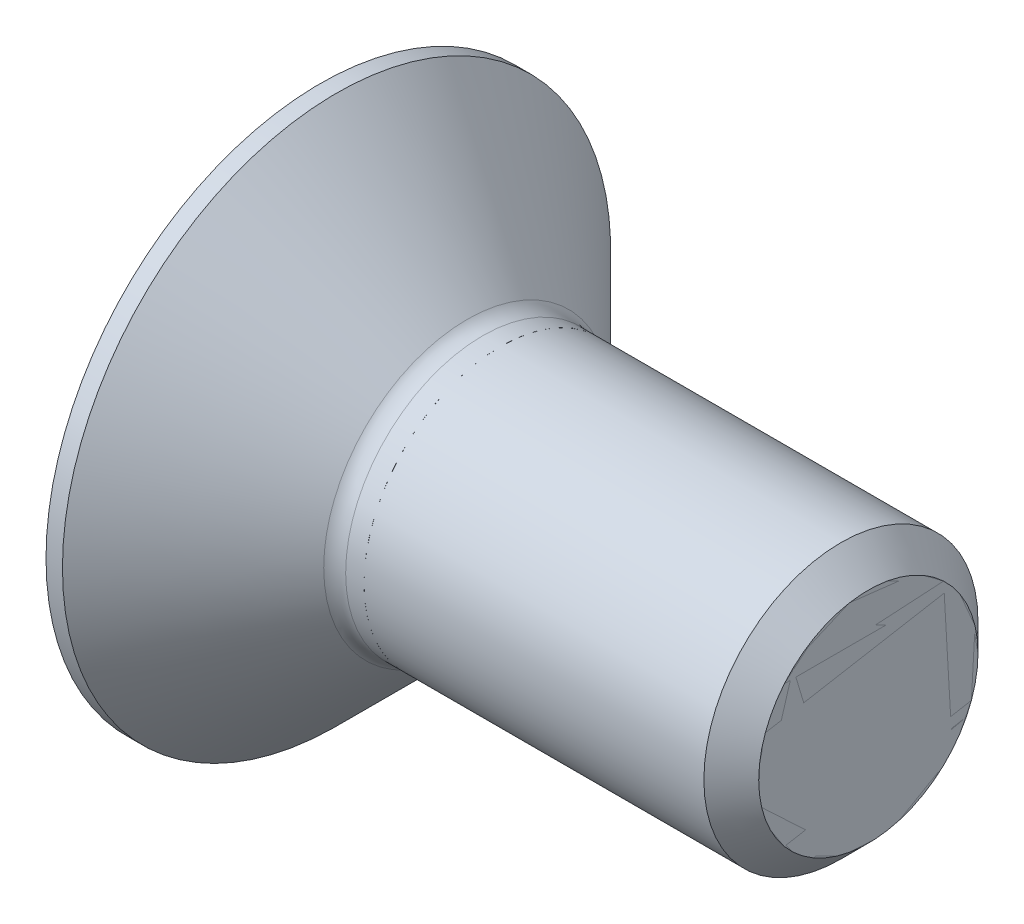
ISO-10303-21;
HEADER;
FILE_DESCRIPTION(('STEP AP214'),'2;1');
FILE_NAME('part.step','',(''),(''),'','','');
FILE_SCHEMA(('AUTOMOTIVE_DESIGN { 1 0 10303 214 1 1 1 1 }'));
ENDSEC;
DATA;
#1=APPLICATION_CONTEXT('core data for automotive mechanical design processes');
#2=APPLICATION_PROTOCOL_DEFINITION('international standard','automotive_design',2000,#1);
#3=PRODUCT_CONTEXT('',#1,'mechanical');
#4=PRODUCT('Part','Part','',(#3));
#5=PRODUCT_RELATED_PRODUCT_CATEGORY('part','',(#4));
#6=PRODUCT_DEFINITION_FORMATION('','',#4);
#7=PRODUCT_DEFINITION_CONTEXT('part definition',#1,'design');
#8=PRODUCT_DEFINITION('design','',#6,#7);
#9=PRODUCT_DEFINITION_SHAPE('','',#8);
#10=(LENGTH_UNIT() NAMED_UNIT(*) SI_UNIT(.MILLI.,.METRE.));
#11=(NAMED_UNIT(*) PLANE_ANGLE_UNIT() SI_UNIT($,.RADIAN.));
#12=(NAMED_UNIT(*) SI_UNIT($,.STERADIAN.) SOLID_ANGLE_UNIT());
#13=UNCERTAINTY_MEASURE_WITH_UNIT(LENGTH_MEASURE(1.E-05),#10,'distance_accuracy_value','');
#14=(GEOMETRIC_REPRESENTATION_CONTEXT(3) GLOBAL_UNCERTAINTY_ASSIGNED_CONTEXT((#13)) GLOBAL_UNIT_ASSIGNED_CONTEXT((#10,
#11,#12)) REPRESENTATION_CONTEXT('',''));
#15=CARTESIAN_POINT('',(0.,0.,0.));
#16=DIRECTION('',(0.,0.,1.));
#17=DIRECTION('',(1.,0.,0.));
#18=AXIS2_PLACEMENT_3D('',#15,#16,#17);
#19=CARTESIAN_POINT('',(3.3,0.,0.));
#20=DIRECTION('',(1.,0.,0.));
#21=DIRECTION('',(0.,0.,-1.));
#22=AXIS2_PLACEMENT_3D('',#19,#20,#21);
#23=PLANE('',#22);
#24=CARTESIAN_POINT('',(3.3,-2.5,0.));
#25=CARTESIAN_POINT('',(3.3,-2.49934722205978,-0.498585870546376));
#26=CARTESIAN_POINT('',(3.3,-2.30968945034045,-0.956755200090909));
#27=CARTESIAN_POINT('',(3.3,-2.11973283017346,-1.41564647839428));
#28=CARTESIAN_POINT('',(3.3,-1.76776217720748,-1.76776623167858));
#29=CARTESIAN_POINT('',(3.3,-1.416624506483,-2.11905264985695));
#30=CARTESIAN_POINT('',(3.3,-0.956706947708022,-2.30969593332014));
#31=CARTESIAN_POINT('',(3.3,-0.49787000559976,-2.49989128365797));
#32=CARTESIAN_POINT('',(3.3,0.,-2.50000000000033));
#33=CARTESIAN_POINT('',(3.3,0.496779917289219,-2.50010847830783));
#34=CARTESIAN_POINT('',(3.3,0.956706947708022,-2.30969593332014));
#35=CARTESIAN_POINT('',(3.3,1.41570183727927,-2.11966930022571));
#36=CARTESIAN_POINT('',(3.3,1.76776217720748,-1.76776623167858));
#37=CARTESIAN_POINT('',(3.3,2.11911540790603,-1.41656995648331));
#38=CARTESIAN_POINT('',(3.3,2.30968945034048,-0.956755200090844));
#39=CARTESIAN_POINT('',(3.3,2.49934647953767,-0.499153002202741));
#40=CARTESIAN_POINT('',(3.3,2.5,0.));
#41=B_SPLINE_CURVE_WITH_KNOTS('',2,(#24,#25,#26,#27,#28,#29,#30,#31,#32,#33,#34,#35,#36,#37,#38,
#39,#40),.UNSPECIFIED.,.F.,.F.,(3,2,2,2,2,2,2,2,3),(0.,0.125,0.25,0.375,0.5,0.625,0.75,0.875,
1.),.UNSPECIFIED.);
#42=CARTESIAN_POINT('',(3.3,-2.5,0.));
#43=VERTEX_POINT('',#42);
#44=CARTESIAN_POINT('',(3.3,2.5,0.));
#45=VERTEX_POINT('',#44);
#46=EDGE_CURVE('P0_E32',#43,#45,#41,.T.);
#47=ORIENTED_EDGE('',*,*,#46,.F.);
#48=CARTESIAN_POINT('',(3.3,2.5,0.));
#49=CARTESIAN_POINT('',(3.3,2.49934722205978,0.498585870546314));
#50=CARTESIAN_POINT('',(3.3,2.30968945034048,0.956755200090844));
#51=CARTESIAN_POINT('',(3.3,2.11973283017372,1.41564647839373));
#52=CARTESIAN_POINT('',(3.3,1.76776217720748,1.76776623167858));
#53=CARTESIAN_POINT('',(3.3,1.41662450648315,2.1190526498571));
#54=CARTESIAN_POINT('',(3.3,0.956706947708022,2.30969593332014));
#55=CARTESIAN_POINT('',(3.3,0.497870005599254,2.49989128365797));
#56=CARTESIAN_POINT('',(3.3,0.,2.50000000000033));
#57=CARTESIAN_POINT('',(3.3,-0.496779917288573,2.50010847830783));
#58=CARTESIAN_POINT('',(3.3,-0.956706947708022,2.30969593332014));
#59=CARTESIAN_POINT('',(3.3,-1.41570183727864,2.11966930022624));
#60=CARTESIAN_POINT('',(3.3,-1.76776217720748,1.76776623167858));
#61=CARTESIAN_POINT('',(3.3,-2.11911540790621,1.41656995648322));
#62=CARTESIAN_POINT('',(3.3,-2.30968945034045,0.956755200090909));
#63=CARTESIAN_POINT('',(3.3,-2.49934647953767,0.499153002202374));
#64=CARTESIAN_POINT('',(3.3,-2.5,0.));
#65=B_SPLINE_CURVE_WITH_KNOTS('',2,(#48,#49,#50,#51,#52,#53,#54,#55,#56,#57,#58,#59,#60,#61,#62,
#63,#64),.UNSPECIFIED.,.F.,.F.,(3,2,2,2,2,2,2,2,3),(0.,0.125,0.25,0.375,0.5,0.625,0.75,0.875,
1.),.UNSPECIFIED.);
#66=EDGE_CURVE('P0_E30',#45,#43,#65,.T.);
#67=ORIENTED_EDGE('',*,*,#66,.F.);
#68=EDGE_LOOP('',(#47,#67));
#69=FACE_BOUND('',#68,.T.);
#70=ADVANCED_FACE('P0_F17',(#69),#23,.F.);
#71=CARTESIAN_POINT('',(10.,0.,0.));
#72=DIRECTION('',(1.,0.,0.));
#73=DIRECTION('',(0.,0.,-1.));
#74=AXIS2_PLACEMENT_3D('',#71,#72,#73);
#75=PLANE('',#74);
#76=CARTESIAN_POINT('',(10.,0.,0.));
#77=DIRECTION('',(1.,0.,0.));
#78=DIRECTION('',(0.,0.,-1.));
#79=AXIS2_PLACEMENT_3D('',#76,#77,#78);
#80=CIRCLE('',#79,2.);
#81=CARTESIAN_POINT('',(10.,0.,-2.));
#82=VERTEX_POINT('',#81);
#83=EDGE_CURVE('P0_E20',#82,#82,#80,.F.);
#84=ORIENTED_EDGE('',*,*,#83,.F.);
#85=EDGE_LOOP('',(#84));
#86=FACE_BOUND('',#85,.T.);
#87=ADVANCED_FACE('P0_F50',(#86),#75,.T.);
#88=CARTESIAN_POINT('',(3.3,0.,0.));
#89=DIRECTION('',(1.,0.,0.));
#90=DIRECTION('',(0.,0.,-1.));
#91=AXIS2_PLACEMENT_3D('',#88,#89,#90);
#92=PLANE('',#91);
#93=CARTESIAN_POINT('',(3.3,0.,0.));
#94=DIRECTION('',(1.,0.,0.));
#95=DIRECTION('',(0.,0.,-1.));
#96=AXIS2_PLACEMENT_3D('',#93,#94,#95);
#97=CIRCLE('',#96,2.);
#98=CARTESIAN_POINT('',(3.3,0.,-2.));
#99=VERTEX_POINT('',#98);
#100=EDGE_CURVE('P0_E11',#99,#99,#97,.T.);
#101=ORIENTED_EDGE('',*,*,#100,.F.);
#102=EDGE_LOOP('',(#101));
#103=FACE_BOUND('',#102,.T.);
#104=ORIENTED_EDGE('',*,*,#46,.T.);
#105=ORIENTED_EDGE('',*,*,#66,.T.);
#106=EDGE_LOOP('',(#104,#105));
#107=FACE_BOUND('',#106,.T.);
#108=ADVANCED_FACE('P0_F35',(#103,#107),#92,.T.);
#109=CARTESIAN_POINT('',(2.965,0.,0.));
#110=DIRECTION('',(1.,0.,0.));
#111=DIRECTION('',(0.,0.,-1.));
#112=AXIS2_PLACEMENT_3D('',#109,#110,#111);
#113=CYLINDRICAL_SURFACE('',#112,2.);
#114=ORIENTED_EDGE('',*,*,#83,.T.);
#115=EDGE_LOOP('',(#114));
#116=FACE_BOUND('',#115,.T.);
#117=ORIENTED_EDGE('',*,*,#100,.T.);
#118=EDGE_LOOP('',(#117));
#119=FACE_BOUND('',#118,.T.);
#120=ADVANCED_FACE('P0_F49',(#116,#119),#113,.T.);
#121=CLOSED_SHELL('',(#70,#87,#108,#120));
#122=MANIFOLD_SOLID_BREP('P0_B1',#121);
#123=CARTESIAN_POINT('',(10.,0.,0.));
#124=DIRECTION('',(-1.,0.,0.));
#125=DIRECTION('',(0.,0.,1.));
#126=AXIS2_PLACEMENT_3D('',#123,#124,#125);
#127=PLANE('',#126);
#128=CARTESIAN_POINT('',(9.99999999999091,0.,0.));
#129=DIRECTION('',(-1.,0.,0.));
#130=DIRECTION('',(0.,0.,1.));
#131=AXIS2_PLACEMENT_3D('',#128,#129,#130);
#132=CIRCLE('',#131,2.00000000006639);
#133=CARTESIAN_POINT('',(9.99999999999091,0.,2.00000000006639));
#134=VERTEX_POINT('',#133);
#135=EDGE_CURVE('P1_E20',#134,#134,#132,.T.);
#136=ORIENTED_EDGE('',*,*,#135,.F.);
#137=EDGE_LOOP('',(#136));
#138=FACE_BOUND('',#137,.T.);
#139=ADVANCED_FACE('P1_F17',(#138),#127,.F.);
#140=CARTESIAN_POINT('',(9.50000000005957,0.,0.));
#141=DIRECTION('',(-1.,0.,0.));
#142=DIRECTION('',(0.,0.,1.));
#143=AXIS2_PLACEMENT_3D('',#140,#141,#142);
#144=CONICAL_SURFACE('',#143,2.49999999999773,0.785398163397448);
#145=ORIENTED_EDGE('',*,*,#135,.T.);
#146=EDGE_LOOP('',(#145));
#147=FACE_BOUND('',#146,.T.);
#148=CARTESIAN_POINT('',(9.5,0.,0.));
#149=DIRECTION('',(-1.,0.,0.));
#150=DIRECTION('',(0.,0.,1.));
#151=AXIS2_PLACEMENT_3D('',#148,#149,#150);
#152=CIRCLE('',#151,2.5);
#153=CARTESIAN_POINT('',(9.5,0.,2.5));
#154=VERTEX_POINT('',#153);
#155=EDGE_CURVE('P1_E89',#154,#154,#152,.T.);
#156=ORIENTED_EDGE('',*,*,#155,.F.);
#157=EDGE_LOOP('',(#156));
#158=FACE_BOUND('',#157,.T.);
#159=ADVANCED_FACE('P1_F114',(#147,#158),#144,.T.);
#160=CARTESIAN_POINT('',(10.5,0.,0.));
#161=DIRECTION('',(-1.,0.,0.));
#162=DIRECTION('',(0.,0.,1.));
#163=AXIS2_PLACEMENT_3D('',#160,#161,#162);
#164=CYLINDRICAL_SURFACE('',#163,2.5);
#165=ORIENTED_EDGE('',*,*,#155,.T.);
#166=EDGE_LOOP('',(#165));
#167=FACE_BOUND('',#166,.T.);
#168=CARTESIAN_POINT('',(2.965685424949,0.,0.));
#169=DIRECTION('',(-1.,0.,0.));
#170=DIRECTION('',(0.,1.,0.));
#171=AXIS2_PLACEMENT_3D('',#168,#169,#170);
#172=CIRCLE('',#171,2.5);
#173=CARTESIAN_POINT('',(2.965685424949,2.5,0.));
#174=VERTEX_POINT('',#173);
#175=EDGE_CURVE('P1_E81',#174,#174,#172,.F.);
#176=ORIENTED_EDGE('',*,*,#175,.T.);
#177=EDGE_LOOP('',(#176));
#178=FACE_BOUND('',#177,.T.);
#179=ADVANCED_FACE('P1_F112',(#167,#178),#164,.T.);
#180=CARTESIAN_POINT('',(2.3,1.5,-0.8660254037844));
#181=DIRECTION('',(0.,0.500000000000017,-0.866025403784429));
#182=DIRECTION('',(0.,0.866025403784429,0.500000000000017));
#183=AXIS2_PLACEMENT_3D('',#180,#181,#182);
#184=PLANE('',#183);
#185=DIRECTION('',(0.,0.866025403784429,0.500000000000017));
#186=VECTOR('',#185,1.);
#187=CARTESIAN_POINT('',(2.3,1.5,-0.8660254037844));
#188=LINE('',#187,#186);
#189=CARTESIAN_POINT('',(2.3,1.5,-0.8660254037844));
#190=VERTEX_POINT('',#189);
#191=CARTESIAN_POINT('',(2.3,0.,-1.73205080756895));
#192=VERTEX_POINT('',#191);
#193=EDGE_CURVE('P1_E65',#190,#192,#188,.F.);
#194=ORIENTED_EDGE('',*,*,#193,.F.);
#195=DIRECTION('',(1.,0.,0.));
#196=VECTOR('',#195,1.);
#197=CARTESIAN_POINT('',(2.3,1.5,-0.8660254037844));
#198=LINE('',#197,#196);
#199=CARTESIAN_POINT('',(0.,1.5,-0.8660254037844));
#200=VERTEX_POINT('',#199);
#201=EDGE_CURVE('P1_E87',#190,#200,#198,.F.);
#202=ORIENTED_EDGE('',*,*,#201,.T.);
#203=DIRECTION('',(0.,0.866025403784429,0.500000000000017));
#204=VECTOR('',#203,1.);
#205=CARTESIAN_POINT('',(0.,1.5,-0.8660254037844));
#206=LINE('',#205,#204);
#207=CARTESIAN_POINT('',(0.,0.,-1.73205080756898));
#208=VERTEX_POINT('',#207);
#209=EDGE_CURVE('P1_E73',#208,#200,#206,.T.);
#210=ORIENTED_EDGE('',*,*,#209,.F.);
#211=DIRECTION('',(1.,0.,0.));
#212=VECTOR('',#211,1.);
#213=CARTESIAN_POINT('',(2.3,0.,-1.732050807569));
#214=LINE('',#213,#212);
#215=EDGE_CURVE('P1_E80',#208,#192,#214,.T.);
#216=ORIENTED_EDGE('',*,*,#215,.T.);
#217=EDGE_LOOP('',(#194,#202,#210,#216));
#218=FACE_BOUND('',#217,.T.);
#219=ADVANCED_FACE('P1_F84',(#218),#184,.F.);
#220=CARTESIAN_POINT('',(2.965685424949,0.,0.));
#221=DIRECTION('',(-1.,0.,0.));
#222=DIRECTION('',(0.,1.,0.));
#223=AXIS2_PLACEMENT_3D('',#220,#221,#222);
#224=TOROIDAL_SURFACE('',#223,2.9,0.4);
#225=ORIENTED_EDGE('',*,*,#175,.F.);
#226=EDGE_LOOP('',(#225));
#227=FACE_BOUND('',#226,.T.);
#228=CARTESIAN_POINT('',(2.68284271248831,0.,0.));
#229=DIRECTION('',(-1.,0.,0.));
#230=DIRECTION('',(0.,1.,0.));
#231=AXIS2_PLACEMENT_3D('',#228,#229,#230);
#232=CIRCLE('',#231,2.61715728754552);
#233=CARTESIAN_POINT('',(2.68284271248831,2.61715728754552,0.));
#234=VERTEX_POINT('',#233);
#235=EDGE_CURVE('P1_E98',#234,#234,#232,.T.);
#236=ORIENTED_EDGE('',*,*,#235,.F.);
#237=EDGE_LOOP('',(#236));
#238=FACE_BOUND('',#237,.T.);
#239=ADVANCED_FACE('P1_F104',(#227,#238),#224,.F.);
#240=CARTESIAN_POINT('',(2.3,0.,-1.732050807569));
#241=DIRECTION('',(0.,-0.500000000000017,-0.866025403784429));
#242=DIRECTION('',(0.,0.866025403784429,-0.500000000000017));
#243=AXIS2_PLACEMENT_3D('',#240,#241,#242);
#244=PLANE('',#243);
#245=DIRECTION('',(0.,0.866025403784429,-0.500000000000017));
#246=VECTOR('',#245,1.);
#247=CARTESIAN_POINT('',(2.3,0.,-1.732050807569));
#248=LINE('',#247,#246);
#249=CARTESIAN_POINT('',(2.3,-1.50000000000003,-0.866025403784446));
#250=VERTEX_POINT('',#249);
#251=EDGE_CURVE('P1_E92',#192,#250,#248,.F.);
#252=ORIENTED_EDGE('',*,*,#251,.F.);
#253=ORIENTED_EDGE('',*,*,#215,.F.);
#254=DIRECTION('',(0.,0.866025403784429,-0.500000000000017));
#255=VECTOR('',#254,1.);
#256=CARTESIAN_POINT('',(0.,0.,-1.732050807569));
#257=LINE('',#256,#255);
#258=CARTESIAN_POINT('',(0.,-1.50000000000001,-0.866025403784423));
#259=VERTEX_POINT('',#258);
#260=EDGE_CURVE('P1_E69',#259,#208,#257,.T.);
#261=ORIENTED_EDGE('',*,*,#260,.F.);
#262=DIRECTION('',(1.,0.,0.));
#263=VECTOR('',#262,1.);
#264=CARTESIAN_POINT('',(2.3,-1.5,-0.8660254037844));
#265=LINE('',#264,#263);
#266=EDGE_CURVE('P1_E164',#259,#250,#265,.T.);
#267=ORIENTED_EDGE('',*,*,#266,.T.);
#268=EDGE_LOOP('',(#252,#253,#261,#267));
#269=FACE_BOUND('',#268,.T.);
#270=ADVANCED_FACE('P1_F91',(#269),#244,.F.);
#271=CARTESIAN_POINT('',(2.3,1.5,0.8660254037844));
#272=DIRECTION('',(0.,1.,0.));
#273=DIRECTION('',(0.,0.,1.));
#274=AXIS2_PLACEMENT_3D('',#271,#272,#273);
#275=PLANE('',#274);
#276=DIRECTION('',(0.,0.,1.));
#277=VECTOR('',#276,1.);
#278=CARTESIAN_POINT('',(2.3,1.5,0.));
#279=LINE('',#278,#277);
#280=CARTESIAN_POINT('',(2.3,1.50000000000001,0.866025403784423));
#281=VERTEX_POINT('',#280);
#282=EDGE_CURVE('P1_E159',#281,#190,#279,.F.);
#283=ORIENTED_EDGE('',*,*,#282,.F.);
#284=DIRECTION('',(1.,0.,0.));
#285=VECTOR('',#284,1.);
#286=CARTESIAN_POINT('',(2.3,1.50000000000005,0.866025403784492));
#287=LINE('',#286,#285);
#288=CARTESIAN_POINT('',(0.,1.50000000000001,0.866025403784423));
#289=VERTEX_POINT('',#288);
#290=EDGE_CURVE('P1_E162',#281,#289,#287,.F.);
#291=ORIENTED_EDGE('',*,*,#290,.T.);
#292=DIRECTION('',(0.,0.,1.));
#293=VECTOR('',#292,1.);
#294=CARTESIAN_POINT('',(0.,1.5,0.8660254037844));
#295=LINE('',#294,#293);
#296=EDGE_CURVE('P1_E94',#200,#289,#295,.T.);
#297=ORIENTED_EDGE('',*,*,#296,.F.);
#298=ORIENTED_EDGE('',*,*,#201,.F.);
#299=EDGE_LOOP('',(#283,#291,#297,#298));
#300=FACE_BOUND('',#299,.T.);
#301=ADVANCED_FACE('P1_F151',(#300),#275,.F.);
#302=CARTESIAN_POINT('',(0.300000000095224,0.,0.));
#303=DIRECTION('',(-1.,0.,0.));
#304=DIRECTION('',(0.,0.,1.));
#305=AXIS2_PLACEMENT_3D('',#302,#303,#304);
#306=CONICAL_SURFACE('',#305,4.99999999993861,0.785398163397448);
#307=ORIENTED_EDGE('',*,*,#235,.T.);
#308=EDGE_LOOP('',(#307));
#309=FACE_BOUND('',#308,.T.);
#310=CARTESIAN_POINT('',(0.3,0.,0.));
#311=DIRECTION('',(-1.,0.,0.));
#312=DIRECTION('',(0.,0.,1.));
#313=AXIS2_PLACEMENT_3D('',#310,#311,#312);
#314=CIRCLE('',#313,5.);
#315=CARTESIAN_POINT('',(0.3,0.,5.));
#316=VERTEX_POINT('',#315);
#317=EDGE_CURVE('P1_E173',#316,#316,#314,.T.);
#318=ORIENTED_EDGE('',*,*,#317,.F.);
#319=EDGE_LOOP('',(#318));
#320=FACE_BOUND('',#319,.T.);
#321=ADVANCED_FACE('P1_F148',(#309,#320),#306,.T.);
#322=CARTESIAN_POINT('',(2.3,-1.5,-0.8660254037844));
#323=DIRECTION('',(0.,-1.,0.));
#324=DIRECTION('',(0.,0.,-1.));
#325=AXIS2_PLACEMENT_3D('',#322,#323,#324);
#326=PLANE('',#325);
#327=DIRECTION('',(0.,0.,1.));
#328=VECTOR('',#327,1.);
#329=CARTESIAN_POINT('',(2.3,-1.5,0.));
#330=LINE('',#329,#328);
#331=CARTESIAN_POINT('',(2.3,-1.5,0.8660254037844));
#332=VERTEX_POINT('',#331);
#333=EDGE_CURVE('P1_E163',#250,#332,#330,.T.);
#334=ORIENTED_EDGE('',*,*,#333,.F.);
#335=ORIENTED_EDGE('',*,*,#266,.F.);
#336=DIRECTION('',(0.,0.,-1.));
#337=VECTOR('',#336,1.);
#338=CARTESIAN_POINT('',(0.,-1.5,-0.8660254037844));
#339=LINE('',#338,#337);
#340=CARTESIAN_POINT('',(0.,-1.5,0.8660254037844));
#341=VERTEX_POINT('',#340);
#342=EDGE_CURVE('P1_E75',#341,#259,#339,.T.);
#343=ORIENTED_EDGE('',*,*,#342,.F.);
#344=DIRECTION('',(1.,0.,0.));
#345=VECTOR('',#344,1.);
#346=CARTESIAN_POINT('',(2.3,-1.5,0.8660254037844));
#347=LINE('',#346,#345);
#348=EDGE_CURVE('P1_E176',#341,#332,#347,.T.);
#349=ORIENTED_EDGE('',*,*,#348,.T.);
#350=EDGE_LOOP('',(#334,#335,#343,#349));
#351=FACE_BOUND('',#350,.T.);
#352=ADVANCED_FACE('P1_F145',(#351),#326,.F.);
#353=CARTESIAN_POINT('',(2.3,0.,0.));
#354=DIRECTION('',(-1.,0.,0.));
#355=DIRECTION('',(0.,0.,1.));
#356=AXIS2_PLACEMENT_3D('',#353,#354,#355);
#357=PLANE('',#356);
#358=ORIENTED_EDGE('',*,*,#333,.T.);
#359=DIRECTION('',(0.,-0.866025403784429,-0.500000000000017));
#360=VECTOR('',#359,1.);
#361=CARTESIAN_POINT('',(2.3,-1.5,0.8660254037844));
#362=LINE('',#361,#360);
#363=CARTESIAN_POINT('',(2.3,0.,1.73205080756898));
#364=VERTEX_POINT('',#363);
#365=EDGE_CURVE('P1_E170',#332,#364,#362,.F.);
#366=ORIENTED_EDGE('',*,*,#365,.T.);
#367=DIRECTION('',(0.,-0.866025403784429,0.500000000000017));
#368=VECTOR('',#367,1.);
#369=CARTESIAN_POINT('',(2.3,0.,1.732050807569));
#370=LINE('',#369,#368);
#371=EDGE_CURVE('P1_E167',#364,#281,#370,.F.);
#372=ORIENTED_EDGE('',*,*,#371,.T.);
#373=ORIENTED_EDGE('',*,*,#282,.T.);
#374=ORIENTED_EDGE('',*,*,#193,.T.);
#375=ORIENTED_EDGE('',*,*,#251,.T.);
#376=EDGE_LOOP('',(#358,#366,#372,#373,#374,#375));
#377=FACE_BOUND('',#376,.T.);
#378=ADVANCED_FACE('P1_F141',(#377),#357,.T.);
#379=CARTESIAN_POINT('',(2.3,0.,1.732050807569));
#380=DIRECTION('',(0.,0.500000000000017,0.866025403784429));
#381=DIRECTION('',(0.,-0.866025403784429,0.500000000000017));
#382=AXIS2_PLACEMENT_3D('',#379,#380,#381);
#383=PLANE('',#382);
#384=ORIENTED_EDGE('',*,*,#371,.F.);
#385=DIRECTION('',(1.,0.,0.));
#386=VECTOR('',#385,1.);
#387=CARTESIAN_POINT('',(2.3,0.,1.73205080756891));
#388=LINE('',#387,#386);
#389=CARTESIAN_POINT('',(0.,0.,1.73205080756898));
#390=VERTEX_POINT('',#389);
#391=EDGE_CURVE('P1_E188',#364,#390,#388,.F.);
#392=ORIENTED_EDGE('',*,*,#391,.T.);
#393=DIRECTION('',(0.,-0.866025403784429,0.500000000000017));
#394=VECTOR('',#393,1.);
#395=CARTESIAN_POINT('',(0.,0.,1.732050807569));
#396=LINE('',#395,#394);
#397=EDGE_CURVE('P1_E34',#289,#390,#396,.T.);
#398=ORIENTED_EDGE('',*,*,#397,.F.);
#399=ORIENTED_EDGE('',*,*,#290,.F.);
#400=EDGE_LOOP('',(#384,#392,#398,#399));
#401=FACE_BOUND('',#400,.T.);
#402=ADVANCED_FACE('P1_F137',(#401),#383,.F.);
#403=CARTESIAN_POINT('',(10.5,0.,0.));
#404=DIRECTION('',(-1.,0.,0.));
#405=DIRECTION('',(0.,0.,1.));
#406=AXIS2_PLACEMENT_3D('',#403,#404,#405);
#407=CYLINDRICAL_SURFACE('',#406,5.);
#408=ORIENTED_EDGE('',*,*,#317,.T.);
#409=EDGE_LOOP('',(#408));
#410=FACE_BOUND('',#409,.T.);
#411=CARTESIAN_POINT('',(0.,0.,0.));
#412=DIRECTION('',(-1.,0.,0.));
#413=DIRECTION('',(0.,0.,1.));
#414=AXIS2_PLACEMENT_3D('',#411,#412,#413);
#415=CIRCLE('',#414,5.);
#416=CARTESIAN_POINT('',(0.,0.,5.));
#417=VERTEX_POINT('',#416);
#418=EDGE_CURVE('P1_E26',#417,#417,#415,.T.);
#419=ORIENTED_EDGE('',*,*,#418,.F.);
#420=EDGE_LOOP('',(#419));
#421=FACE_BOUND('',#420,.T.);
#422=ADVANCED_FACE('P1_F131',(#410,#421),#407,.T.);
#423=CARTESIAN_POINT('',(2.3,-1.5,0.8660254037844));
#424=DIRECTION('',(0.,-0.500000000000017,0.866025403784429));
#425=DIRECTION('',(0.,-0.866025403784429,-0.500000000000017));
#426=AXIS2_PLACEMENT_3D('',#423,#424,#425);
#427=PLANE('',#426);
#428=ORIENTED_EDGE('',*,*,#365,.F.);
#429=ORIENTED_EDGE('',*,*,#348,.F.);
#430=DIRECTION('',(0.,-0.866025403784398,-0.50000000000007));
#431=VECTOR('',#430,1.);
#432=CARTESIAN_POINT('',(0.,0.,1.732050807569));
#433=LINE('',#432,#431);
#434=EDGE_CURVE('P1_E11',#390,#341,#433,.T.);
#435=ORIENTED_EDGE('',*,*,#434,.F.);
#436=ORIENTED_EDGE('',*,*,#391,.F.);
#437=EDGE_LOOP('',(#428,#429,#435,#436));
#438=FACE_BOUND('',#437,.T.);
#439=ADVANCED_FACE('P1_F126',(#438),#427,.F.);
#440=CARTESIAN_POINT('',(0.,0.,0.));
#441=DIRECTION('',(-1.,0.,0.));
#442=DIRECTION('',(0.,0.,1.));
#443=AXIS2_PLACEMENT_3D('',#440,#441,#442);
#444=PLANE('',#443);
#445=ORIENTED_EDGE('',*,*,#397,.T.);
#446=ORIENTED_EDGE('',*,*,#434,.T.);
#447=ORIENTED_EDGE('',*,*,#342,.T.);
#448=ORIENTED_EDGE('',*,*,#260,.T.);
#449=ORIENTED_EDGE('',*,*,#209,.T.);
#450=ORIENTED_EDGE('',*,*,#296,.T.);
#451=EDGE_LOOP('',(#445,#446,#447,#448,#449,#450));
#452=FACE_BOUND('',#451,.T.);
#453=ORIENTED_EDGE('',*,*,#418,.T.);
#454=EDGE_LOOP('',(#453));
#455=FACE_BOUND('',#454,.T.);
#456=ADVANCED_FACE('P1_F71',(#452,#455),#444,.T.);
#457=CLOSED_SHELL('',(#139,#159,#179,#219,#239,#270,#301,#321,#352,#378,#402,#422,#439,#456));
#458=MANIFOLD_SOLID_BREP('P1_B1',#457);
#459=ADVANCED_BREP_SHAPE_REPRESENTATION('',(#18,#122,#458),#14);
#460=SHAPE_DEFINITION_REPRESENTATION(#9,#459);
ENDSEC;
END-ISO-10303-21;
